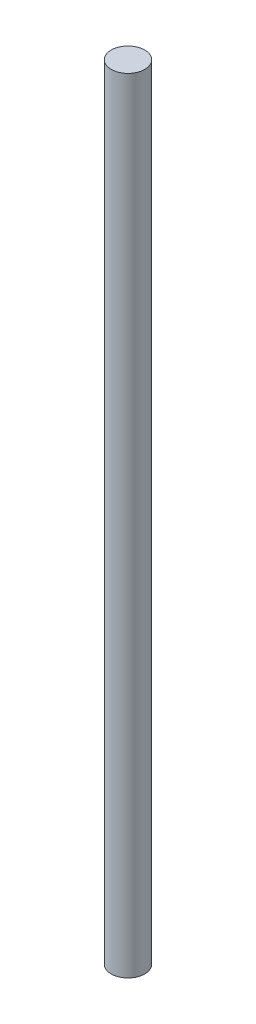
ISO-10303-21;
HEADER;
FILE_DESCRIPTION(('STEP AP214'),'2;1');
FILE_NAME('part.step','',(''),(''),'','','');
FILE_SCHEMA(('AUTOMOTIVE_DESIGN { 1 0 10303 214 1 1 1 1 }'));
ENDSEC;
DATA;
#1=APPLICATION_CONTEXT('core data for automotive mechanical design processes');
#2=APPLICATION_PROTOCOL_DEFINITION('international standard','automotive_design',2000,#1);
#3=PRODUCT_CONTEXT('',#1,'mechanical');
#4=PRODUCT('Part','Part','',(#3));
#5=PRODUCT_RELATED_PRODUCT_CATEGORY('part','',(#4));
#6=PRODUCT_DEFINITION_FORMATION('','',#4);
#7=PRODUCT_DEFINITION_CONTEXT('part definition',#1,'design');
#8=PRODUCT_DEFINITION('design','',#6,#7);
#9=PRODUCT_DEFINITION_SHAPE('','',#8);
#10=(LENGTH_UNIT() NAMED_UNIT(*) SI_UNIT(.MILLI.,.METRE.));
#11=(NAMED_UNIT(*) PLANE_ANGLE_UNIT() SI_UNIT($,.RADIAN.));
#12=(NAMED_UNIT(*) SI_UNIT($,.STERADIAN.) SOLID_ANGLE_UNIT());
#13=UNCERTAINTY_MEASURE_WITH_UNIT(LENGTH_MEASURE(1.E-05),#10,'distance_accuracy_value','');
#14=(GEOMETRIC_REPRESENTATION_CONTEXT(3) GLOBAL_UNCERTAINTY_ASSIGNED_CONTEXT((#13)) GLOBAL_UNIT_ASSIGNED_CONTEXT((#10,
#11,#12)) REPRESENTATION_CONTEXT('',''));
#15=CARTESIAN_POINT('',(0.,0.,0.));
#16=DIRECTION('',(0.,0.,1.));
#17=DIRECTION('',(1.,0.,0.));
#18=AXIS2_PLACEMENT_3D('',#15,#16,#17);
#19=CARTESIAN_POINT('',(0.,140.,0.));
#20=DIRECTION('',(0.,-1.,0.));
#21=DIRECTION('',(0.,0.,-1.));
#22=AXIS2_PLACEMENT_3D('',#19,#20,#21);
#23=CYLINDRICAL_SURFACE('',#22,3.);
#24=CARTESIAN_POINT('',(0.,140.,0.));
#25=DIRECTION('',(0.,1.,0.));
#26=DIRECTION('',(0.,0.,1.));
#27=AXIS2_PLACEMENT_3D('',#24,#25,#26);
#28=CIRCLE('',#27,3.);
#29=CARTESIAN_POINT('',(0.,140.,3.));
#30=VERTEX_POINT('',#29);
#31=EDGE_CURVE('E10',#30,#30,#28,.T.);
#32=ORIENTED_EDGE('',*,*,#31,.F.);
#33=EDGE_LOOP('',(#32));
#34=FACE_BOUND('',#33,.T.);
#35=CARTESIAN_POINT('',(0.,0.,0.));
#36=DIRECTION('',(0.,1.,0.));
#37=DIRECTION('',(0.,0.,1.));
#38=AXIS2_PLACEMENT_3D('',#35,#36,#37);
#39=CIRCLE('',#38,3.);
#40=CARTESIAN_POINT('',(0.,0.,3.));
#41=VERTEX_POINT('',#40);
#42=EDGE_CURVE('E40',#41,#41,#39,.T.);
#43=ORIENTED_EDGE('',*,*,#42,.T.);
#44=EDGE_LOOP('',(#43));
#45=FACE_BOUND('',#44,.T.);
#46=ADVANCED_FACE('F37',(#34,#45),#23,.T.);
#47=CARTESIAN_POINT('',(0.,140.,0.));
#48=DIRECTION('',(0.,1.,0.));
#49=DIRECTION('',(0.,0.,1.));
#50=AXIS2_PLACEMENT_3D('',#47,#48,#49);
#51=PLANE('',#50);
#52=ORIENTED_EDGE('',*,*,#31,.T.);
#53=EDGE_LOOP('',(#52));
#54=FACE_BOUND('',#53,.T.);
#55=ADVANCED_FACE('F52',(#54),#51,.T.);
#56=CARTESIAN_POINT('',(0.,0.,0.));
#57=DIRECTION('',(0.,1.,0.));
#58=DIRECTION('',(0.,0.,1.));
#59=AXIS2_PLACEMENT_3D('',#56,#57,#58);
#60=PLANE('',#59);
#61=ORIENTED_EDGE('',*,*,#42,.F.);
#62=EDGE_LOOP('',(#61));
#63=FACE_BOUND('',#62,.T.);
#64=ADVANCED_FACE('F50',(#63),#60,.F.);
#65=CLOSED_SHELL('',(#46,#55,#64));
#66=MANIFOLD_SOLID_BREP('B2',#65);
#67=ADVANCED_BREP_SHAPE_REPRESENTATION('',(#18,#66),#14);
#68=SHAPE_DEFINITION_REPRESENTATION(#9,#67);
ENDSEC;
END-ISO-10303-21;
